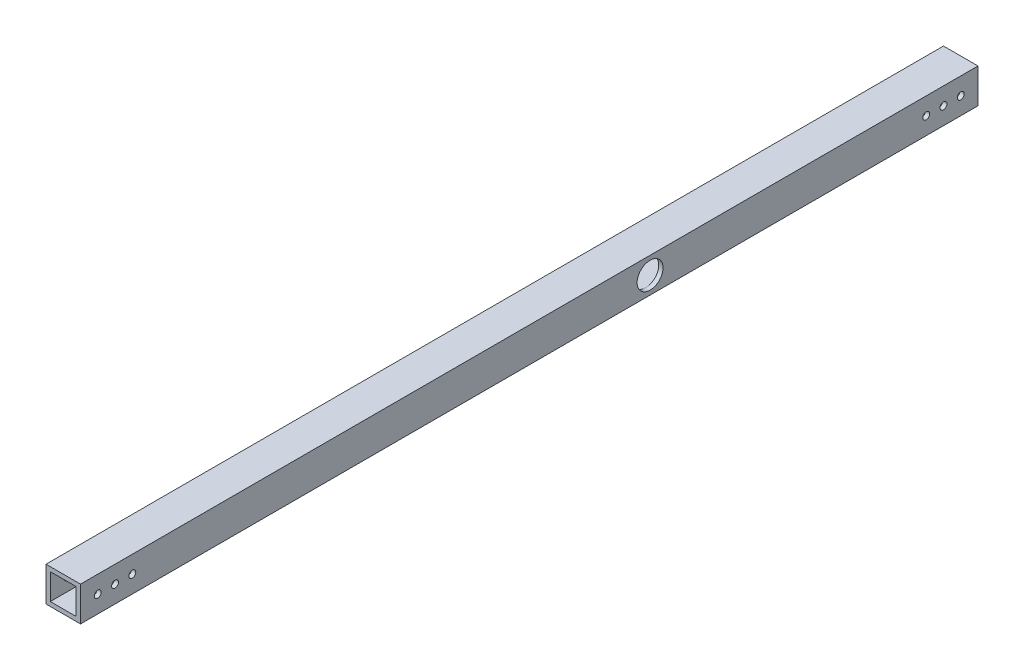
ISO-10303-21;
HEADER;
FILE_DESCRIPTION(('STEP AP214'),'2;1');
FILE_NAME('part.step','',(''),(''),'','','');
FILE_SCHEMA(('AUTOMOTIVE_DESIGN { 1 0 10303 214 1 1 1 1 }'));
ENDSEC;
DATA;
#1=APPLICATION_CONTEXT('core data for automotive mechanical design processes');
#2=APPLICATION_PROTOCOL_DEFINITION('international standard','automotive_design',2000,#1);
#3=PRODUCT_CONTEXT('',#1,'mechanical');
#4=PRODUCT('Part','Part','',(#3));
#5=PRODUCT_RELATED_PRODUCT_CATEGORY('part','',(#4));
#6=PRODUCT_DEFINITION_FORMATION('','',#4);
#7=PRODUCT_DEFINITION_CONTEXT('part definition',#1,'design');
#8=PRODUCT_DEFINITION('design','',#6,#7);
#9=PRODUCT_DEFINITION_SHAPE('','',#8);
#10=(LENGTH_UNIT() NAMED_UNIT(*) SI_UNIT(.MILLI.,.METRE.));
#11=(NAMED_UNIT(*) PLANE_ANGLE_UNIT() SI_UNIT($,.RADIAN.));
#12=(NAMED_UNIT(*) SI_UNIT($,.STERADIAN.) SOLID_ANGLE_UNIT());
#13=UNCERTAINTY_MEASURE_WITH_UNIT(LENGTH_MEASURE(1.E-05),#10,'distance_accuracy_value','');
#14=(GEOMETRIC_REPRESENTATION_CONTEXT(3) GLOBAL_UNCERTAINTY_ASSIGNED_CONTEXT((#13)) GLOBAL_UNIT_ASSIGNED_CONTEXT((#10,
#11,#12)) REPRESENTATION_CONTEXT('',''));
#15=CARTESIAN_POINT('',(0.,0.,0.));
#16=DIRECTION('',(0.,0.,1.));
#17=DIRECTION('',(1.,0.,0.));
#18=AXIS2_PLACEMENT_3D('',#15,#16,#17);
#19=CARTESIAN_POINT('',(-3.175,0.,660.4));
#20=DIRECTION('',(-1.,0.,0.));
#21=DIRECTION('',(0.,-1.,0.));
#22=AXIS2_PLACEMENT_3D('',#19,#20,#21);
#23=PLANE('',#22);
#24=CARTESIAN_POINT('',(-3.175,12.7,622.3));
#25=DIRECTION('',(-1.,0.,0.));
#26=DIRECTION('',(0.,-1.,0.));
#27=AXIS2_PLACEMENT_3D('',#24,#25,#26);
#28=CIRCLE('',#27,2.55269999999999);
#29=CARTESIAN_POINT('',(-3.175,10.1473,622.3));
#30=VERTEX_POINT('',#29);
#31=EDGE_CURVE('E569',#30,#30,#28,.T.);
#32=ORIENTED_EDGE('',*,*,#31,.F.);
#33=EDGE_LOOP('',(#32));
#34=FACE_BOUND('',#33,.T.);
#35=CARTESIAN_POINT('',(-3.175,12.7,635.));
#36=DIRECTION('',(-1.,0.,0.));
#37=DIRECTION('',(0.,-1.,0.));
#38=AXIS2_PLACEMENT_3D('',#35,#36,#37);
#39=CIRCLE('',#38,2.55269999999999);
#40=CARTESIAN_POINT('',(-3.175,10.1473,635.));
#41=VERTEX_POINT('',#40);
#42=EDGE_CURVE('E598',#41,#41,#39,.T.);
#43=ORIENTED_EDGE('',*,*,#42,.F.);
#44=EDGE_LOOP('',(#43));
#45=FACE_BOUND('',#44,.T.);
#46=CARTESIAN_POINT('',(-3.175,12.7,647.7));
#47=DIRECTION('',(-1.,0.,0.));
#48=DIRECTION('',(0.,-1.,0.));
#49=AXIS2_PLACEMENT_3D('',#46,#47,#48);
#50=CIRCLE('',#49,2.55269999999999);
#51=CARTESIAN_POINT('',(-3.175,10.1473,647.7));
#52=VERTEX_POINT('',#51);
#53=EDGE_CURVE('E614',#52,#52,#50,.T.);
#54=ORIENTED_EDGE('',*,*,#53,.F.);
#55=EDGE_LOOP('',(#54));
#56=FACE_BOUND('',#55,.T.);
#57=CARTESIAN_POINT('',(-3.175,12.7,241.3));
#58=DIRECTION('',(-1.,0.,0.));
#59=DIRECTION('',(0.,-1.,0.));
#60=AXIS2_PLACEMENT_3D('',#57,#58,#59);
#61=CIRCLE('',#60,9.52500000000005);
#62=CARTESIAN_POINT('',(-3.175,3.17499999999997,241.3));
#63=VERTEX_POINT('',#62);
#64=CARTESIAN_POINT('',(-3.175,22.225,241.3));
#65=VERTEX_POINT('',#64);
#66=EDGE_CURVE('E80',#63,#65,#61,.T.);
#67=ORIENTED_EDGE('',*,*,#66,.F.);
#68=DIRECTION('',(0.,0.,-1.));
#69=VECTOR('',#68,1.);
#70=CARTESIAN_POINT('',(-3.175,3.175,660.4));
#71=LINE('',#70,#69);
#72=CARTESIAN_POINT('',(-3.175,3.175,660.4));
#73=VERTEX_POINT('',#72);
#74=EDGE_CURVE('E152',#73,#63,#71,.T.);
#75=ORIENTED_EDGE('',*,*,#74,.F.);
#76=DIRECTION('',(0.,1.,0.));
#77=VECTOR('',#76,1.);
#78=CARTESIAN_POINT('',(-3.175,0.,660.4));
#79=LINE('',#78,#77);
#80=CARTESIAN_POINT('',(-3.175,22.225,660.4));
#81=VERTEX_POINT('',#80);
#82=EDGE_CURVE('E275',#73,#81,#79,.T.);
#83=ORIENTED_EDGE('',*,*,#82,.T.);
#84=DIRECTION('',(0.,0.,-1.));
#85=VECTOR('',#84,1.);
#86=CARTESIAN_POINT('',(-3.175,22.225,660.4));
#87=LINE('',#86,#85);
#88=EDGE_CURVE('E155',#81,#65,#87,.T.);
#89=ORIENTED_EDGE('',*,*,#88,.T.);
#90=EDGE_LOOP('',(#67,#75,#83,#89));
#91=FACE_BOUND('',#90,.T.);
#92=ADVANCED_FACE('F63',(#34,#45,#56,#91),#23,.T.);
#93=CARTESIAN_POINT('',(-22.225,0.,660.4));
#94=DIRECTION('',(1.,0.,0.));
#95=DIRECTION('',(0.,0.,-1.));
#96=AXIS2_PLACEMENT_3D('',#93,#94,#95);
#97=PLANE('',#96);
#98=CARTESIAN_POINT('',(-22.225,12.7,622.3));
#99=DIRECTION('',(1.,0.,0.));
#100=DIRECTION('',(0.,0.,-1.));
#101=AXIS2_PLACEMENT_3D('',#98,#99,#100);
#102=CIRCLE('',#101,2.55269999999999);
#103=CARTESIAN_POINT('',(-22.225,12.7,619.7473));
#104=VERTEX_POINT('',#103);
#105=EDGE_CURVE('E574',#104,#104,#102,.T.);
#106=ORIENTED_EDGE('',*,*,#105,.F.);
#107=EDGE_LOOP('',(#106));
#108=FACE_BOUND('',#107,.T.);
#109=CARTESIAN_POINT('',(-22.225,12.7,635.));
#110=DIRECTION('',(1.,0.,0.));
#111=DIRECTION('',(0.,0.,-1.));
#112=AXIS2_PLACEMENT_3D('',#109,#110,#111);
#113=CIRCLE('',#112,2.55269999999999);
#114=CARTESIAN_POINT('',(-22.225,12.7,632.4473));
#115=VERTEX_POINT('',#114);
#116=EDGE_CURVE('E594',#115,#115,#113,.T.);
#117=ORIENTED_EDGE('',*,*,#116,.F.);
#118=EDGE_LOOP('',(#117));
#119=FACE_BOUND('',#118,.T.);
#120=CARTESIAN_POINT('',(-22.225,12.7,647.7));
#121=DIRECTION('',(1.,0.,0.));
#122=DIRECTION('',(0.,0.,-1.));
#123=AXIS2_PLACEMENT_3D('',#120,#121,#122);
#124=CIRCLE('',#123,2.55269999999999);
#125=CARTESIAN_POINT('',(-22.225,12.7,645.1473));
#126=VERTEX_POINT('',#125);
#127=EDGE_CURVE('E610',#126,#126,#124,.T.);
#128=ORIENTED_EDGE('',*,*,#127,.F.);
#129=EDGE_LOOP('',(#128));
#130=FACE_BOUND('',#129,.T.);
#131=CARTESIAN_POINT('',(-22.225,12.7,241.3));
#132=DIRECTION('',(1.,0.,0.));
#133=DIRECTION('',(0.,0.,-1.));
#134=AXIS2_PLACEMENT_3D('',#131,#132,#133);
#135=CIRCLE('',#134,9.52500000000005);
#136=CARTESIAN_POINT('',(-22.225,22.225,241.3));
#137=VERTEX_POINT('',#136);
#138=CARTESIAN_POINT('',(-22.225,3.175,241.3));
#139=VERTEX_POINT('',#138);
#140=EDGE_CURVE('E87',#137,#139,#135,.T.);
#141=ORIENTED_EDGE('',*,*,#140,.F.);
#142=DIRECTION('',(0.,0.,-1.));
#143=VECTOR('',#142,1.);
#144=CARTESIAN_POINT('',(-22.225,22.225,660.4));
#145=LINE('',#144,#143);
#146=CARTESIAN_POINT('',(-22.225,22.225,660.4));
#147=VERTEX_POINT('',#146);
#148=EDGE_CURVE('E183',#147,#137,#145,.T.);
#149=ORIENTED_EDGE('',*,*,#148,.F.);
#150=DIRECTION('',(0.,-1.,0.));
#151=VECTOR('',#150,1.);
#152=CARTESIAN_POINT('',(-22.225,0.,660.4));
#153=LINE('',#152,#151);
#154=CARTESIAN_POINT('',(-22.225,3.175,660.4));
#155=VERTEX_POINT('',#154);
#156=EDGE_CURVE('E281',#147,#155,#153,.T.);
#157=ORIENTED_EDGE('',*,*,#156,.T.);
#158=DIRECTION('',(0.,0.,-1.));
#159=VECTOR('',#158,1.);
#160=CARTESIAN_POINT('',(-22.225,3.175,660.4));
#161=LINE('',#160,#159);
#162=EDGE_CURVE('E174',#155,#139,#161,.T.);
#163=ORIENTED_EDGE('',*,*,#162,.T.);
#164=EDGE_LOOP('',(#141,#149,#157,#163));
#165=FACE_BOUND('',#164,.T.);
#166=ADVANCED_FACE('F301',(#108,#119,#130,#165),#97,.T.);
#167=CARTESIAN_POINT('',(0.,0.,660.4));
#168=DIRECTION('',(0.,0.,1.));
#169=DIRECTION('',(1.,0.,0.));
#170=AXIS2_PLACEMENT_3D('',#167,#168,#169);
#171=PLANE('',#170);
#172=DIRECTION('',(0.,1.,0.));
#173=VECTOR('',#172,1.);
#174=CARTESIAN_POINT('',(0.,0.,660.4));
#175=LINE('',#174,#173);
#176=CARTESIAN_POINT('',(0.,0.,660.4));
#177=VERTEX_POINT('',#176);
#178=CARTESIAN_POINT('',(0.,25.4,660.4));
#179=VERTEX_POINT('',#178);
#180=EDGE_CURVE('E191',#177,#179,#175,.T.);
#181=ORIENTED_EDGE('',*,*,#180,.T.);
#182=DIRECTION('',(-1.,0.,0.));
#183=VECTOR('',#182,1.);
#184=CARTESIAN_POINT('',(0.,25.4,660.4));
#185=LINE('',#184,#183);
#186=CARTESIAN_POINT('',(-25.4,25.4,660.4));
#187=VERTEX_POINT('',#186);
#188=EDGE_CURVE('E195',#179,#187,#185,.T.);
#189=ORIENTED_EDGE('',*,*,#188,.T.);
#190=DIRECTION('',(0.,-1.,0.));
#191=VECTOR('',#190,1.);
#192=CARTESIAN_POINT('',(-25.4,0.,660.4));
#193=LINE('',#192,#191);
#194=CARTESIAN_POINT('',(-25.4,0.,660.4));
#195=VERTEX_POINT('',#194);
#196=EDGE_CURVE('E199',#187,#195,#193,.T.);
#197=ORIENTED_EDGE('',*,*,#196,.T.);
#198=DIRECTION('',(1.,0.,0.));
#199=VECTOR('',#198,1.);
#200=CARTESIAN_POINT('',(0.,0.,660.4));
#201=LINE('',#200,#199);
#202=EDGE_CURVE('E202',#195,#177,#201,.T.);
#203=ORIENTED_EDGE('',*,*,#202,.T.);
#204=EDGE_LOOP('',(#181,#189,#197,#203));
#205=FACE_BOUND('',#204,.T.);
#206=DIRECTION('',(-1.,0.,0.));
#207=VECTOR('',#206,1.);
#208=CARTESIAN_POINT('',(0.,22.225,660.4));
#209=LINE('',#208,#207);
#210=EDGE_CURVE('E278',#81,#147,#209,.T.);
#211=ORIENTED_EDGE('',*,*,#210,.F.);
#212=ORIENTED_EDGE('',*,*,#82,.F.);
#213=DIRECTION('',(1.,0.,0.));
#214=VECTOR('',#213,1.);
#215=CARTESIAN_POINT('',(0.,3.175,660.4));
#216=LINE('',#215,#214);
#217=EDGE_CURVE('E166',#155,#73,#216,.T.);
#218=ORIENTED_EDGE('',*,*,#217,.F.);
#219=ORIENTED_EDGE('',*,*,#156,.F.);
#220=EDGE_LOOP('',(#211,#212,#218,#219));
#221=FACE_BOUND('',#220,.T.);
#222=ADVANCED_FACE('F307',(#205,#221),#171,.T.);
#223=CARTESIAN_POINT('',(0.,0.,0.));
#224=DIRECTION('',(0.,0.,1.));
#225=DIRECTION('',(1.,0.,0.));
#226=AXIS2_PLACEMENT_3D('',#223,#224,#225);
#227=PLANE('',#226);
#228=DIRECTION('',(0.,1.,0.));
#229=VECTOR('',#228,1.);
#230=CARTESIAN_POINT('',(0.,0.,0.));
#231=LINE('',#230,#229);
#232=CARTESIAN_POINT('',(0.,0.,0.));
#233=VERTEX_POINT('',#232);
#234=CARTESIAN_POINT('',(0.,25.4,0.));
#235=VERTEX_POINT('',#234);
#236=EDGE_CURVE('E190',#233,#235,#231,.T.);
#237=ORIENTED_EDGE('',*,*,#236,.F.);
#238=DIRECTION('',(1.,0.,0.));
#239=VECTOR('',#238,1.);
#240=CARTESIAN_POINT('',(0.,0.,0.));
#241=LINE('',#240,#239);
#242=CARTESIAN_POINT('',(-25.4,0.,0.));
#243=VERTEX_POINT('',#242);
#244=EDGE_CURVE('E196',#243,#233,#241,.T.);
#245=ORIENTED_EDGE('',*,*,#244,.F.);
#246=DIRECTION('',(0.,-1.,0.));
#247=VECTOR('',#246,1.);
#248=CARTESIAN_POINT('',(-25.4,0.,0.));
#249=LINE('',#248,#247);
#250=CARTESIAN_POINT('',(-25.4,25.4,0.));
#251=VERTEX_POINT('',#250);
#252=EDGE_CURVE('E212',#251,#243,#249,.T.);
#253=ORIENTED_EDGE('',*,*,#252,.F.);
#254=DIRECTION('',(-1.,0.,0.));
#255=VECTOR('',#254,1.);
#256=CARTESIAN_POINT('',(0.,25.4,0.));
#257=LINE('',#256,#255);
#258=EDGE_CURVE('E209',#235,#251,#257,.T.);
#259=ORIENTED_EDGE('',*,*,#258,.F.);
#260=EDGE_LOOP('',(#237,#245,#253,#259));
#261=FACE_BOUND('',#260,.T.);
#262=DIRECTION('',(0.,1.,0.));
#263=VECTOR('',#262,1.);
#264=CARTESIAN_POINT('',(-3.175,0.,0.));
#265=LINE('',#264,#263);
#266=CARTESIAN_POINT('',(-3.175,3.175,0.));
#267=VERTEX_POINT('',#266);
#268=CARTESIAN_POINT('',(-3.175,22.225,0.));
#269=VERTEX_POINT('',#268);
#270=EDGE_CURVE('E157',#267,#269,#265,.T.);
#271=ORIENTED_EDGE('',*,*,#270,.T.);
#272=DIRECTION('',(-1.,0.,0.));
#273=VECTOR('',#272,1.);
#274=CARTESIAN_POINT('',(0.,22.225,0.));
#275=LINE('',#274,#273);
#276=CARTESIAN_POINT('',(-22.225,22.225,0.));
#277=VERTEX_POINT('',#276);
#278=EDGE_CURVE('E289',#269,#277,#275,.T.);
#279=ORIENTED_EDGE('',*,*,#278,.T.);
#280=DIRECTION('',(0.,-1.,0.));
#281=VECTOR('',#280,1.);
#282=CARTESIAN_POINT('',(-22.225,0.,0.));
#283=LINE('',#282,#281);
#284=CARTESIAN_POINT('',(-22.225,3.175,0.));
#285=VERTEX_POINT('',#284);
#286=EDGE_CURVE('E292',#277,#285,#283,.T.);
#287=ORIENTED_EDGE('',*,*,#286,.T.);
#288=DIRECTION('',(1.,0.,0.));
#289=VECTOR('',#288,1.);
#290=CARTESIAN_POINT('',(0.,3.175,0.));
#291=LINE('',#290,#289);
#292=EDGE_CURVE('E177',#285,#267,#291,.T.);
#293=ORIENTED_EDGE('',*,*,#292,.T.);
#294=EDGE_LOOP('',(#271,#279,#287,#293));
#295=FACE_BOUND('',#294,.T.);
#296=ADVANCED_FACE('F298',(#261,#295),#227,.F.);
#297=CARTESIAN_POINT('',(0.,0.,660.4));
#298=DIRECTION('',(-1.,0.,0.));
#299=DIRECTION('',(0.,-1.,0.));
#300=AXIS2_PLACEMENT_3D('',#297,#298,#299);
#301=PLANE('',#300);
#302=CARTESIAN_POINT('',(1.11022302462516E-13,12.7,622.3));
#303=DIRECTION('',(-1.,0.,0.));
#304=DIRECTION('',(0.,0.,1.));
#305=AXIS2_PLACEMENT_3D('',#302,#303,#304);
#306=CIRCLE('',#305,2.5527);
#307=CARTESIAN_POINT('',(1.11022302462516E-13,12.7,624.8527));
#308=VERTEX_POINT('',#307);
#309=EDGE_CURVE('E572',#308,#308,#306,.T.);
#310=ORIENTED_EDGE('',*,*,#309,.T.);
#311=EDGE_LOOP('',(#310));
#312=FACE_BOUND('',#311,.T.);
#313=CARTESIAN_POINT('',(1.11022302462516E-13,12.7,635.));
#314=DIRECTION('',(-1.,0.,0.));
#315=DIRECTION('',(0.,0.,1.));
#316=AXIS2_PLACEMENT_3D('',#313,#314,#315);
#317=CIRCLE('',#316,2.5527);
#318=CARTESIAN_POINT('',(1.11022302462516E-13,12.7,637.5527));
#319=VERTEX_POINT('',#318);
#320=EDGE_CURVE('E590',#319,#319,#317,.T.);
#321=ORIENTED_EDGE('',*,*,#320,.T.);
#322=EDGE_LOOP('',(#321));
#323=FACE_BOUND('',#322,.T.);
#324=CARTESIAN_POINT('',(1.11022302462516E-13,12.7,647.7));
#325=DIRECTION('',(-1.,0.,0.));
#326=DIRECTION('',(0.,0.,1.));
#327=AXIS2_PLACEMENT_3D('',#324,#325,#326);
#328=CIRCLE('',#327,2.5527);
#329=CARTESIAN_POINT('',(1.11022302462516E-13,12.7,650.2527));
#330=VERTEX_POINT('',#329);
#331=EDGE_CURVE('E606',#330,#330,#328,.T.);
#332=ORIENTED_EDGE('',*,*,#331,.T.);
#333=EDGE_LOOP('',(#332));
#334=FACE_BOUND('',#333,.T.);
#335=CARTESIAN_POINT('',(1.11022302462516E-13,12.7,12.7));
#336=DIRECTION('',(-1.,0.,0.));
#337=DIRECTION('',(0.,0.,1.));
#338=AXIS2_PLACEMENT_3D('',#335,#336,#337);
#339=CIRCLE('',#338,2.5527);
#340=CARTESIAN_POINT('',(1.11022302462516E-13,12.7,15.2527));
#341=VERTEX_POINT('',#340);
#342=EDGE_CURVE('E622',#341,#341,#339,.T.);
#343=ORIENTED_EDGE('',*,*,#342,.T.);
#344=EDGE_LOOP('',(#343));
#345=FACE_BOUND('',#344,.T.);
#346=CARTESIAN_POINT('',(1.11022302462516E-13,12.7,25.4));
#347=DIRECTION('',(-1.,0.,0.));
#348=DIRECTION('',(0.,0.,1.));
#349=AXIS2_PLACEMENT_3D('',#346,#347,#348);
#350=CIRCLE('',#349,2.5527);
#351=CARTESIAN_POINT('',(1.11022302462516E-13,12.7,27.9527));
#352=VERTEX_POINT('',#351);
#353=EDGE_CURVE('E236',#352,#352,#350,.T.);
#354=ORIENTED_EDGE('',*,*,#353,.T.);
#355=EDGE_LOOP('',(#354));
#356=FACE_BOUND('',#355,.T.);
#357=CARTESIAN_POINT('',(1.11022302462516E-13,12.7,38.1));
#358=DIRECTION('',(-1.,0.,0.));
#359=DIRECTION('',(0.,0.,1.));
#360=AXIS2_PLACEMENT_3D('',#357,#358,#359);
#361=CIRCLE('',#360,2.5527);
#362=CARTESIAN_POINT('',(1.11022302462516E-13,12.7,40.6527));
#363=VERTEX_POINT('',#362);
#364=EDGE_CURVE('E231',#363,#363,#361,.T.);
#365=ORIENTED_EDGE('',*,*,#364,.T.);
#366=EDGE_LOOP('',(#365));
#367=FACE_BOUND('',#366,.T.);
#368=CARTESIAN_POINT('',(0.,12.7,241.3));
#369=DIRECTION('',(-1.,0.,0.));
#370=DIRECTION('',(0.,0.,1.));
#371=AXIS2_PLACEMENT_3D('',#368,#369,#370);
#372=CIRCLE('',#371,9.52500000000005);
#373=CARTESIAN_POINT('',(0.,12.7,250.825));
#374=VERTEX_POINT('',#373);
#375=EDGE_CURVE('E265',#374,#374,#372,.T.);
#376=ORIENTED_EDGE('',*,*,#375,.T.);
#377=EDGE_LOOP('',(#376));
#378=FACE_BOUND('',#377,.T.);
#379=ORIENTED_EDGE('',*,*,#236,.T.);
#380=DIRECTION('',(0.,0.,-1.));
#381=VECTOR('',#380,1.);
#382=CARTESIAN_POINT('',(0.,25.4,660.4));
#383=LINE('',#382,#381);
#384=EDGE_CURVE('E12',#179,#235,#383,.T.);
#385=ORIENTED_EDGE('',*,*,#384,.F.);
#386=ORIENTED_EDGE('',*,*,#180,.F.);
#387=DIRECTION('',(0.,0.,-1.));
#388=VECTOR('',#387,1.);
#389=CARTESIAN_POINT('',(0.,0.,660.4));
#390=LINE('',#389,#388);
#391=EDGE_CURVE('E205',#177,#233,#390,.T.);
#392=ORIENTED_EDGE('',*,*,#391,.T.);
#393=EDGE_LOOP('',(#379,#385,#386,#392));
#394=FACE_BOUND('',#393,.T.);
#395=ADVANCED_FACE('F65',(#312,#323,#334,#345,#356,#367,#378,#394),#301,.F.);
#396=CARTESIAN_POINT('',(0.,25.4,660.4));
#397=DIRECTION('',(0.,-1.,0.));
#398=DIRECTION('',(1.,0.,0.));
#399=AXIS2_PLACEMENT_3D('',#396,#397,#398);
#400=PLANE('',#399);
#401=ORIENTED_EDGE('',*,*,#258,.T.);
#402=DIRECTION('',(0.,0.,-1.));
#403=VECTOR('',#402,1.);
#404=CARTESIAN_POINT('',(-25.4,25.4,660.4));
#405=LINE('',#404,#403);
#406=EDGE_CURVE('E73',#187,#251,#405,.T.);
#407=ORIENTED_EDGE('',*,*,#406,.F.);
#408=ORIENTED_EDGE('',*,*,#188,.F.);
#409=ORIENTED_EDGE('',*,*,#384,.T.);
#410=EDGE_LOOP('',(#401,#407,#408,#409));
#411=FACE_BOUND('',#410,.T.);
#412=ADVANCED_FACE('F361',(#411),#400,.F.);
#413=CARTESIAN_POINT('',(-25.4,0.,660.4));
#414=DIRECTION('',(1.,0.,0.));
#415=DIRECTION('',(0.,0.,-1.));
#416=AXIS2_PLACEMENT_3D('',#413,#414,#415);
#417=PLANE('',#416);
#418=CARTESIAN_POINT('',(-25.4,12.7,622.3));
#419=DIRECTION('',(-1.,0.,0.));
#420=DIRECTION('',(0.,0.,1.));
#421=AXIS2_PLACEMENT_3D('',#418,#419,#420);
#422=CIRCLE('',#421,2.55269999999999);
#423=CARTESIAN_POINT('',(-25.4,12.7,624.8527));
#424=VERTEX_POINT('',#423);
#425=EDGE_CURVE('E575',#424,#424,#422,.T.);
#426=ORIENTED_EDGE('',*,*,#425,.F.);
#427=EDGE_LOOP('',(#426));
#428=FACE_BOUND('',#427,.T.);
#429=CARTESIAN_POINT('',(-25.4,12.7,635.));
#430=DIRECTION('',(-1.,0.,0.));
#431=DIRECTION('',(0.,0.,1.));
#432=AXIS2_PLACEMENT_3D('',#429,#430,#431);
#433=CIRCLE('',#432,2.55269999999999);
#434=CARTESIAN_POINT('',(-25.4,12.7,637.5527));
#435=VERTEX_POINT('',#434);
#436=EDGE_CURVE('E586',#435,#435,#433,.T.);
#437=ORIENTED_EDGE('',*,*,#436,.F.);
#438=EDGE_LOOP('',(#437));
#439=FACE_BOUND('',#438,.T.);
#440=CARTESIAN_POINT('',(-25.4,12.7,647.7));
#441=DIRECTION('',(-1.,0.,0.));
#442=DIRECTION('',(0.,0.,1.));
#443=AXIS2_PLACEMENT_3D('',#440,#441,#442);
#444=CIRCLE('',#443,2.55269999999999);
#445=CARTESIAN_POINT('',(-25.4,12.7,650.2527));
#446=VERTEX_POINT('',#445);
#447=EDGE_CURVE('E602',#446,#446,#444,.T.);
#448=ORIENTED_EDGE('',*,*,#447,.F.);
#449=EDGE_LOOP('',(#448));
#450=FACE_BOUND('',#449,.T.);
#451=CARTESIAN_POINT('',(-25.4,12.7,12.7));
#452=DIRECTION('',(-1.,0.,0.));
#453=DIRECTION('',(0.,0.,1.));
#454=AXIS2_PLACEMENT_3D('',#451,#452,#453);
#455=CIRCLE('',#454,2.55269999999999);
#456=CARTESIAN_POINT('',(-25.4,12.7,15.2527));
#457=VERTEX_POINT('',#456);
#458=EDGE_CURVE('E618',#457,#457,#455,.T.);
#459=ORIENTED_EDGE('',*,*,#458,.F.);
#460=EDGE_LOOP('',(#459));
#461=FACE_BOUND('',#460,.T.);
#462=CARTESIAN_POINT('',(-25.4,12.7,25.4));
#463=DIRECTION('',(-1.,0.,0.));
#464=DIRECTION('',(0.,0.,1.));
#465=AXIS2_PLACEMENT_3D('',#462,#463,#464);
#466=CIRCLE('',#465,2.55269999999999);
#467=CARTESIAN_POINT('',(-25.4,12.7,27.9527));
#468=VERTEX_POINT('',#467);
#469=EDGE_CURVE('E245',#468,#468,#466,.T.);
#470=ORIENTED_EDGE('',*,*,#469,.F.);
#471=EDGE_LOOP('',(#470));
#472=FACE_BOUND('',#471,.T.);
#473=CARTESIAN_POINT('',(-25.4,12.7,38.1));
#474=DIRECTION('',(-1.,0.,0.));
#475=DIRECTION('',(0.,0.,1.));
#476=AXIS2_PLACEMENT_3D('',#473,#474,#475);
#477=CIRCLE('',#476,2.55269999999999);
#478=CARTESIAN_POINT('',(-25.4,12.7,40.6527));
#479=VERTEX_POINT('',#478);
#480=EDGE_CURVE('E242',#479,#479,#477,.T.);
#481=ORIENTED_EDGE('',*,*,#480,.F.);
#482=EDGE_LOOP('',(#481));
#483=FACE_BOUND('',#482,.T.);
#484=CARTESIAN_POINT('',(-25.4,12.7,241.3));
#485=DIRECTION('',(-1.,0.,0.));
#486=DIRECTION('',(0.,0.,1.));
#487=AXIS2_PLACEMENT_3D('',#484,#485,#486);
#488=CIRCLE('',#487,9.52500000000005);
#489=CARTESIAN_POINT('',(-25.4,12.7,250.825));
#490=VERTEX_POINT('',#489);
#491=EDGE_CURVE('E264',#490,#490,#488,.T.);
#492=ORIENTED_EDGE('',*,*,#491,.F.);
#493=EDGE_LOOP('',(#492));
#494=FACE_BOUND('',#493,.T.);
#495=ORIENTED_EDGE('',*,*,#252,.T.);
#496=DIRECTION('',(0.,0.,-1.));
#497=VECTOR('',#496,1.);
#498=CARTESIAN_POINT('',(-25.4,0.,660.4));
#499=LINE('',#498,#497);
#500=EDGE_CURVE('E220',#195,#243,#499,.T.);
#501=ORIENTED_EDGE('',*,*,#500,.F.);
#502=ORIENTED_EDGE('',*,*,#196,.F.);
#503=ORIENTED_EDGE('',*,*,#406,.T.);
#504=EDGE_LOOP('',(#495,#501,#502,#503));
#505=FACE_BOUND('',#504,.T.);
#506=ADVANCED_FACE('F342',(#428,#439,#450,#461,#472,#483,#494,#505),#417,.F.);
#507=CARTESIAN_POINT('',(0.,0.,660.4));
#508=DIRECTION('',(0.,1.,0.));
#509=DIRECTION('',(0.,0.,1.));
#510=AXIS2_PLACEMENT_3D('',#507,#508,#509);
#511=PLANE('',#510);
#512=ORIENTED_EDGE('',*,*,#244,.T.);
#513=ORIENTED_EDGE('',*,*,#391,.F.);
#514=ORIENTED_EDGE('',*,*,#202,.F.);
#515=ORIENTED_EDGE('',*,*,#500,.T.);
#516=EDGE_LOOP('',(#512,#513,#514,#515));
#517=FACE_BOUND('',#516,.T.);
#518=ADVANCED_FACE('F337',(#517),#511,.F.);
#519=CARTESIAN_POINT('',(-3.175,12.7,12.7));
#520=DIRECTION('',(-1.,0.,0.));
#521=DIRECTION('',(0.,-1.,0.));
#522=AXIS2_PLACEMENT_3D('',#519,#520,#521);
#523=CIRCLE('',#522,2.55269999999999);
#524=CARTESIAN_POINT('',(-3.175,10.1473,12.7));
#525=VERTEX_POINT('',#524);
#526=EDGE_CURVE('E251',#525,#525,#523,.T.);
#527=ORIENTED_EDGE('',*,*,#526,.F.);
#528=EDGE_LOOP('',(#527));
#529=FACE_BOUND('',#528,.T.);
#530=CARTESIAN_POINT('',(-3.175,12.7,25.4));
#531=DIRECTION('',(-1.,0.,0.));
#532=DIRECTION('',(0.,-1.,0.));
#533=AXIS2_PLACEMENT_3D('',#530,#531,#532);
#534=CIRCLE('',#533,2.55269999999999);
#535=CARTESIAN_POINT('',(-3.175,10.1473,25.4));
#536=VERTEX_POINT('',#535);
#537=EDGE_CURVE('E232',#536,#536,#534,.T.);
#538=ORIENTED_EDGE('',*,*,#537,.F.);
#539=EDGE_LOOP('',(#538));
#540=FACE_BOUND('',#539,.T.);
#541=CARTESIAN_POINT('',(-3.175,12.7,38.1));
#542=DIRECTION('',(-1.,0.,0.));
#543=DIRECTION('',(0.,-1.,0.));
#544=AXIS2_PLACEMENT_3D('',#541,#542,#543);
#545=CIRCLE('',#544,2.55269999999999);
#546=CARTESIAN_POINT('',(-3.175,10.1473,38.1));
#547=VERTEX_POINT('',#546);
#548=EDGE_CURVE('E230',#547,#547,#545,.T.);
#549=ORIENTED_EDGE('',*,*,#548,.F.);
#550=EDGE_LOOP('',(#549));
#551=FACE_BOUND('',#550,.T.);
#552=EDGE_CURVE('E140',#65,#63,#61,.T.);
#553=ORIENTED_EDGE('',*,*,#552,.F.);
#554=EDGE_CURVE('E187',#65,#269,#87,.T.);
#555=ORIENTED_EDGE('',*,*,#554,.T.);
#556=ORIENTED_EDGE('',*,*,#270,.F.);
#557=EDGE_CURVE('E159',#63,#267,#71,.T.);
#558=ORIENTED_EDGE('',*,*,#557,.F.);
#559=EDGE_LOOP('',(#553,#555,#556,#558));
#560=FACE_BOUND('',#559,.T.);
#561=ADVANCED_FACE('F160',(#529,#540,#551,#560),#23,.T.);
#562=CARTESIAN_POINT('',(0.,22.225,660.4));
#563=DIRECTION('',(0.,-1.,0.));
#564=DIRECTION('',(1.,0.,0.));
#565=AXIS2_PLACEMENT_3D('',#562,#563,#564);
#566=PLANE('',#565);
#567=ORIENTED_EDGE('',*,*,#148,.T.);
#568=EDGE_CURVE('E182',#137,#277,#145,.T.);
#569=ORIENTED_EDGE('',*,*,#568,.T.);
#570=ORIENTED_EDGE('',*,*,#278,.F.);
#571=ORIENTED_EDGE('',*,*,#554,.F.);
#572=ORIENTED_EDGE('',*,*,#88,.F.);
#573=ORIENTED_EDGE('',*,*,#210,.T.);
#574=EDGE_LOOP('',(#567,#569,#570,#571,#572,#573));
#575=FACE_BOUND('',#574,.T.);
#576=ADVANCED_FACE('F309',(#575),#566,.T.);
#577=CARTESIAN_POINT('',(-22.225,12.7,12.7));
#578=DIRECTION('',(1.,0.,0.));
#579=DIRECTION('',(0.,0.,-1.));
#580=AXIS2_PLACEMENT_3D('',#577,#578,#579);
#581=CIRCLE('',#580,2.55269999999999);
#582=CARTESIAN_POINT('',(-22.225,12.7,10.1473));
#583=VERTEX_POINT('',#582);
#584=EDGE_CURVE('E67',#583,#583,#581,.T.);
#585=ORIENTED_EDGE('',*,*,#584,.F.);
#586=EDGE_LOOP('',(#585));
#587=FACE_BOUND('',#586,.T.);
#588=CARTESIAN_POINT('',(-22.225,12.7,25.4));
#589=DIRECTION('',(1.,0.,0.));
#590=DIRECTION('',(0.,0.,-1.));
#591=AXIS2_PLACEMENT_3D('',#588,#589,#590);
#592=CIRCLE('',#591,2.55269999999999);
#593=CARTESIAN_POINT('',(-22.225,12.7,22.8473));
#594=VERTEX_POINT('',#593);
#595=EDGE_CURVE('E235',#594,#594,#592,.T.);
#596=ORIENTED_EDGE('',*,*,#595,.F.);
#597=EDGE_LOOP('',(#596));
#598=FACE_BOUND('',#597,.T.);
#599=CARTESIAN_POINT('',(-22.225,12.7,38.1));
#600=DIRECTION('',(1.,0.,0.));
#601=DIRECTION('',(0.,0.,-1.));
#602=AXIS2_PLACEMENT_3D('',#599,#600,#601);
#603=CIRCLE('',#602,2.55269999999999);
#604=CARTESIAN_POINT('',(-22.225,12.7,35.5473));
#605=VERTEX_POINT('',#604);
#606=EDGE_CURVE('E227',#605,#605,#603,.T.);
#607=ORIENTED_EDGE('',*,*,#606,.F.);
#608=EDGE_LOOP('',(#607));
#609=FACE_BOUND('',#608,.T.);
#610=EDGE_CURVE('E269',#139,#137,#135,.T.);
#611=ORIENTED_EDGE('',*,*,#610,.F.);
#612=EDGE_CURVE('E172',#139,#285,#161,.T.);
#613=ORIENTED_EDGE('',*,*,#612,.T.);
#614=ORIENTED_EDGE('',*,*,#286,.F.);
#615=ORIENTED_EDGE('',*,*,#568,.F.);
#616=EDGE_LOOP('',(#611,#613,#614,#615));
#617=FACE_BOUND('',#616,.T.);
#618=ADVANCED_FACE('F313',(#587,#598,#609,#617),#97,.T.);
#619=CARTESIAN_POINT('',(0.,3.175,660.4));
#620=DIRECTION('',(0.,1.,0.));
#621=DIRECTION('',(0.,0.,1.));
#622=AXIS2_PLACEMENT_3D('',#619,#620,#621);
#623=PLANE('',#622);
#624=ORIENTED_EDGE('',*,*,#612,.F.);
#625=ORIENTED_EDGE('',*,*,#162,.F.);
#626=ORIENTED_EDGE('',*,*,#217,.T.);
#627=ORIENTED_EDGE('',*,*,#74,.T.);
#628=ORIENTED_EDGE('',*,*,#557,.T.);
#629=ORIENTED_EDGE('',*,*,#292,.F.);
#630=EDGE_LOOP('',(#624,#625,#626,#627,#628,#629));
#631=FACE_BOUND('',#630,.T.);
#632=ADVANCED_FACE('F169',(#631),#623,.T.);
#633=CARTESIAN_POINT('',(0.,12.7,241.3));
#634=DIRECTION('',(-1.,0.,0.));
#635=DIRECTION('',(0.,0.,1.));
#636=AXIS2_PLACEMENT_3D('',#633,#634,#635);
#637=CYLINDRICAL_SURFACE('',#636,9.52500000000005);
#638=ORIENTED_EDGE('',*,*,#140,.T.);
#639=ORIENTED_EDGE('',*,*,#610,.T.);
#640=EDGE_LOOP('',(#638,#639));
#641=FACE_BOUND('',#640,.T.);
#642=ORIENTED_EDGE('',*,*,#491,.T.);
#643=EDGE_LOOP('',(#642));
#644=FACE_BOUND('',#643,.T.);
#645=ADVANCED_FACE('F321',(#641,#644),#637,.F.);
#646=ORIENTED_EDGE('',*,*,#66,.T.);
#647=ORIENTED_EDGE('',*,*,#552,.T.);
#648=EDGE_LOOP('',(#646,#647));
#649=FACE_BOUND('',#648,.T.);
#650=ORIENTED_EDGE('',*,*,#375,.F.);
#651=EDGE_LOOP('',(#650));
#652=FACE_BOUND('',#651,.T.);
#653=ADVANCED_FACE('F141',(#649,#652),#637,.F.);
#654=CARTESIAN_POINT('',(-25.4,12.7,38.1));
#655=DIRECTION('',(-1.,0.,0.));
#656=DIRECTION('',(0.,0.,1.));
#657=AXIS2_PLACEMENT_3D('',#654,#655,#656);
#658=CYLINDRICAL_SURFACE('',#657,2.55269999999999);
#659=ORIENTED_EDGE('',*,*,#606,.T.);
#660=EDGE_LOOP('',(#659));
#661=FACE_BOUND('',#660,.T.);
#662=ORIENTED_EDGE('',*,*,#480,.T.);
#663=EDGE_LOOP('',(#662));
#664=FACE_BOUND('',#663,.T.);
#665=ADVANCED_FACE('F355',(#661,#664),#658,.F.);
#666=ORIENTED_EDGE('',*,*,#548,.T.);
#667=EDGE_LOOP('',(#666));
#668=FACE_BOUND('',#667,.T.);
#669=ORIENTED_EDGE('',*,*,#364,.F.);
#670=EDGE_LOOP('',(#669));
#671=FACE_BOUND('',#670,.T.);
#672=ADVANCED_FACE('F351',(#668,#671),#658,.F.);
#673=CARTESIAN_POINT('',(-25.4,12.7,25.4));
#674=DIRECTION('',(-1.,0.,0.));
#675=DIRECTION('',(0.,0.,1.));
#676=AXIS2_PLACEMENT_3D('',#673,#674,#675);
#677=CYLINDRICAL_SURFACE('',#676,2.55269999999999);
#678=ORIENTED_EDGE('',*,*,#537,.T.);
#679=EDGE_LOOP('',(#678));
#680=FACE_BOUND('',#679,.T.);
#681=ORIENTED_EDGE('',*,*,#353,.F.);
#682=EDGE_LOOP('',(#681));
#683=FACE_BOUND('',#682,.T.);
#684=ADVANCED_FACE('F354',(#680,#683),#677,.F.);
#685=ORIENTED_EDGE('',*,*,#595,.T.);
#686=EDGE_LOOP('',(#685));
#687=FACE_BOUND('',#686,.T.);
#688=ORIENTED_EDGE('',*,*,#469,.T.);
#689=EDGE_LOOP('',(#688));
#690=FACE_BOUND('',#689,.T.);
#691=ADVANCED_FACE('F473',(#687,#690),#677,.F.);
#692=CARTESIAN_POINT('',(-25.4,12.7,12.7));
#693=DIRECTION('',(-1.,0.,0.));
#694=DIRECTION('',(0.,0.,1.));
#695=AXIS2_PLACEMENT_3D('',#692,#693,#694);
#696=CYLINDRICAL_SURFACE('',#695,2.55269999999999);
#697=ORIENTED_EDGE('',*,*,#584,.T.);
#698=EDGE_LOOP('',(#697));
#699=FACE_BOUND('',#698,.T.);
#700=ORIENTED_EDGE('',*,*,#458,.T.);
#701=EDGE_LOOP('',(#700));
#702=FACE_BOUND('',#701,.T.);
#703=ADVANCED_FACE('F482',(#699,#702),#696,.F.);
#704=ORIENTED_EDGE('',*,*,#526,.T.);
#705=EDGE_LOOP('',(#704));
#706=FACE_BOUND('',#705,.T.);
#707=ORIENTED_EDGE('',*,*,#342,.F.);
#708=EDGE_LOOP('',(#707));
#709=FACE_BOUND('',#708,.T.);
#710=ADVANCED_FACE('F491',(#706,#709),#696,.F.);
#711=CARTESIAN_POINT('',(-25.4,12.7,647.7));
#712=DIRECTION('',(-1.,0.,0.));
#713=DIRECTION('',(0.,0.,1.));
#714=AXIS2_PLACEMENT_3D('',#711,#712,#713);
#715=CYLINDRICAL_SURFACE('',#714,2.55269999999999);
#716=ORIENTED_EDGE('',*,*,#127,.T.);
#717=EDGE_LOOP('',(#716));
#718=FACE_BOUND('',#717,.T.);
#719=ORIENTED_EDGE('',*,*,#447,.T.);
#720=EDGE_LOOP('',(#719));
#721=FACE_BOUND('',#720,.T.);
#722=ADVANCED_FACE('F500',(#718,#721),#715,.F.);
#723=ORIENTED_EDGE('',*,*,#53,.T.);
#724=EDGE_LOOP('',(#723));
#725=FACE_BOUND('',#724,.T.);
#726=ORIENTED_EDGE('',*,*,#331,.F.);
#727=EDGE_LOOP('',(#726));
#728=FACE_BOUND('',#727,.T.);
#729=ADVANCED_FACE('F516',(#725,#728),#715,.F.);
#730=CARTESIAN_POINT('',(-25.4,12.7,635.));
#731=DIRECTION('',(-1.,0.,0.));
#732=DIRECTION('',(0.,0.,1.));
#733=AXIS2_PLACEMENT_3D('',#730,#731,#732);
#734=CYLINDRICAL_SURFACE('',#733,2.55269999999999);
#735=ORIENTED_EDGE('',*,*,#116,.T.);
#736=EDGE_LOOP('',(#735));
#737=FACE_BOUND('',#736,.T.);
#738=ORIENTED_EDGE('',*,*,#436,.T.);
#739=EDGE_LOOP('',(#738));
#740=FACE_BOUND('',#739,.T.);
#741=ADVANCED_FACE('F523',(#737,#740),#734,.F.);
#742=ORIENTED_EDGE('',*,*,#42,.T.);
#743=EDGE_LOOP('',(#742));
#744=FACE_BOUND('',#743,.T.);
#745=ORIENTED_EDGE('',*,*,#320,.F.);
#746=EDGE_LOOP('',(#745));
#747=FACE_BOUND('',#746,.T.);
#748=ADVANCED_FACE('F530',(#744,#747),#734,.F.);
#749=CARTESIAN_POINT('',(-25.4,12.7,622.3));
#750=DIRECTION('',(-1.,0.,0.));
#751=DIRECTION('',(0.,0.,1.));
#752=AXIS2_PLACEMENT_3D('',#749,#750,#751);
#753=CYLINDRICAL_SURFACE('',#752,2.55269999999999);
#754=ORIENTED_EDGE('',*,*,#105,.T.);
#755=EDGE_LOOP('',(#754));
#756=FACE_BOUND('',#755,.T.);
#757=ORIENTED_EDGE('',*,*,#425,.T.);
#758=EDGE_LOOP('',(#757));
#759=FACE_BOUND('',#758,.T.);
#760=ADVANCED_FACE('F538',(#756,#759),#753,.F.);
#761=ORIENTED_EDGE('',*,*,#31,.T.);
#762=EDGE_LOOP('',(#761));
#763=FACE_BOUND('',#762,.T.);
#764=ORIENTED_EDGE('',*,*,#309,.F.);
#765=EDGE_LOOP('',(#764));
#766=FACE_BOUND('',#765,.T.);
#767=ADVANCED_FACE('F545',(#763,#766),#753,.F.);
#768=CLOSED_SHELL('',(#92,#166,#222,#296,#395,#412,#506,#518,#561,#576,#618,#632,#645,#653,#665,
#672,#684,#691,#703,#710,#722,#729,#741,#748,#760,#767));
#769=MANIFOLD_SOLID_BREP('B2',#768);
#770=ADVANCED_BREP_SHAPE_REPRESENTATION('',(#18,#769),#14);
#771=SHAPE_DEFINITION_REPRESENTATION(#9,#770);
ENDSEC;
END-ISO-10303-21;
